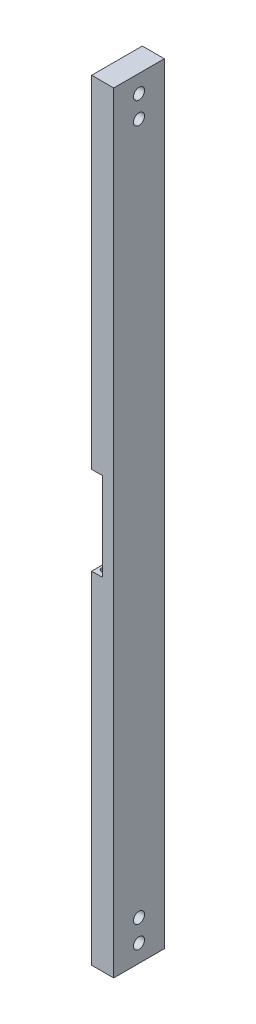
ISO-10303-21;
HEADER;
FILE_DESCRIPTION(('STEP AP214'),'2;1');
FILE_NAME('part.step','',(''),(''),'','','');
FILE_SCHEMA(('AUTOMOTIVE_DESIGN { 1 0 10303 214 1 1 1 1 }'));
ENDSEC;
DATA;
#1=APPLICATION_CONTEXT('core data for automotive mechanical design processes');
#2=APPLICATION_PROTOCOL_DEFINITION('international standard','automotive_design',2000,#1);
#3=PRODUCT_CONTEXT('',#1,'mechanical');
#4=PRODUCT('Part','Part','',(#3));
#5=PRODUCT_RELATED_PRODUCT_CATEGORY('part','',(#4));
#6=PRODUCT_DEFINITION_FORMATION('','',#4);
#7=PRODUCT_DEFINITION_CONTEXT('part definition',#1,'design');
#8=PRODUCT_DEFINITION('design','',#6,#7);
#9=PRODUCT_DEFINITION_SHAPE('','',#8);
#10=(LENGTH_UNIT() NAMED_UNIT(*) SI_UNIT(.MILLI.,.METRE.));
#11=(NAMED_UNIT(*) PLANE_ANGLE_UNIT() SI_UNIT($,.RADIAN.));
#12=(NAMED_UNIT(*) SI_UNIT($,.STERADIAN.) SOLID_ANGLE_UNIT());
#13=UNCERTAINTY_MEASURE_WITH_UNIT(LENGTH_MEASURE(1.E-05),#10,'distance_accuracy_value','');
#14=(GEOMETRIC_REPRESENTATION_CONTEXT(3) GLOBAL_UNCERTAINTY_ASSIGNED_CONTEXT((#13)) GLOBAL_UNIT_ASSIGNED_CONTEXT((#10,
#11,#12)) REPRESENTATION_CONTEXT('',''));
#15=CARTESIAN_POINT('',(0.,0.,0.));
#16=DIRECTION('',(0.,0.,1.));
#17=DIRECTION('',(1.,0.,0.));
#18=AXIS2_PLACEMENT_3D('',#15,#16,#17);
#19=CARTESIAN_POINT('',(-5.,175.,-11.5));
#20=DIRECTION('',(0.,0.,1.));
#21=DIRECTION('',(1.,0.,0.));
#22=AXIS2_PLACEMENT_3D('',#19,#20,#21);
#23=PLANE('',#22);
#24=DIRECTION('',(-1.,0.,0.));
#25=VECTOR('',#24,1.);
#26=CARTESIAN_POINT('',(-4.99999999999939,20.,-11.5));
#27=LINE('',#26,#25);
#28=CARTESIAN_POINT('',(6.12972113628442E-13,20.,-11.5));
#29=VERTEX_POINT('',#28);
#30=CARTESIAN_POINT('',(-4.99999999999939,20.,-11.5));
#31=VERTEX_POINT('',#30);
#32=EDGE_CURVE('E143',#29,#31,#27,.T.);
#33=ORIENTED_EDGE('',*,*,#32,.T.);
#34=DIRECTION('',(0.,-1.,0.));
#35=VECTOR('',#34,1.);
#36=CARTESIAN_POINT('',(-5.,175.,-11.5));
#37=LINE('',#36,#35);
#38=CARTESIAN_POINT('',(-5.,175.,-11.5));
#39=VERTEX_POINT('',#38);
#40=EDGE_CURVE('E42',#39,#31,#37,.T.);
#41=ORIENTED_EDGE('',*,*,#40,.F.);
#42=DIRECTION('',(-1.,0.,0.));
#43=VECTOR('',#42,1.);
#44=CARTESIAN_POINT('',(-5.,175.,-11.5));
#45=LINE('',#44,#43);
#46=CARTESIAN_POINT('',(5.,175.,-11.5));
#47=VERTEX_POINT('',#46);
#48=EDGE_CURVE('E228',#47,#39,#45,.T.);
#49=ORIENTED_EDGE('',*,*,#48,.F.);
#50=DIRECTION('',(0.,-1.,0.));
#51=VECTOR('',#50,1.);
#52=CARTESIAN_POINT('',(5.,175.,-11.5));
#53=LINE('',#52,#51);
#54=CARTESIAN_POINT('',(5.,-175.,-11.5));
#55=VERTEX_POINT('',#54);
#56=EDGE_CURVE('E11',#47,#55,#53,.T.);
#57=ORIENTED_EDGE('',*,*,#56,.T.);
#58=DIRECTION('',(-1.,0.,0.));
#59=VECTOR('',#58,1.);
#60=CARTESIAN_POINT('',(-5.,-175.,-11.5));
#61=LINE('',#60,#59);
#62=CARTESIAN_POINT('',(-5.,-175.,-11.5));
#63=VERTEX_POINT('',#62);
#64=EDGE_CURVE('E238',#55,#63,#61,.T.);
#65=ORIENTED_EDGE('',*,*,#64,.T.);
#66=CARTESIAN_POINT('',(-4.99999999999938,-20.,-11.5));
#67=VERTEX_POINT('',#66);
#68=EDGE_CURVE('E250',#67,#63,#37,.T.);
#69=ORIENTED_EDGE('',*,*,#68,.F.);
#70=DIRECTION('',(1.,0.,0.));
#71=VECTOR('',#70,1.);
#72=CARTESIAN_POINT('',(-4.99999999999938,-20.,-11.5));
#73=LINE('',#72,#71);
#74=CARTESIAN_POINT('',(6.17870700825031E-13,-20.,-11.5));
#75=VERTEX_POINT('',#74);
#76=EDGE_CURVE('E146',#67,#75,#73,.T.);
#77=ORIENTED_EDGE('',*,*,#76,.T.);
#78=DIRECTION('',(0.,1.,0.));
#79=VECTOR('',#78,1.);
#80=CARTESIAN_POINT('',(6.12972113628442E-13,20.,-11.5));
#81=LINE('',#80,#79);
#82=EDGE_CURVE('E138',#75,#29,#81,.T.);
#83=ORIENTED_EDGE('',*,*,#82,.T.);
#84=EDGE_LOOP('',(#33,#41,#49,#57,#65,#69,#77,#83));
#85=FACE_BOUND('',#84,.T.);
#86=ADVANCED_FACE('F34',(#85),#23,.F.);
#87=CARTESIAN_POINT('',(-5.,175.,-11.5));
#88=DIRECTION('',(1.,0.,0.));
#89=DIRECTION('',(0.,0.,-1.));
#90=AXIS2_PLACEMENT_3D('',#87,#88,#89);
#91=PLANE('',#90);
#92=CARTESIAN_POINT('',(-5.,157.,0.));
#93=DIRECTION('',(1.,0.,0.));
#94=DIRECTION('',(0.,0.,-1.));
#95=AXIS2_PLACEMENT_3D('',#92,#93,#94);
#96=CIRCLE('',#95,2.5);
#97=CARTESIAN_POINT('',(-5.,157.,-2.5));
#98=VERTEX_POINT('',#97);
#99=EDGE_CURVE('E220',#98,#98,#96,.T.);
#100=ORIENTED_EDGE('',*,*,#99,.T.);
#101=EDGE_LOOP('',(#100));
#102=FACE_BOUND('',#101,.T.);
#103=CARTESIAN_POINT('',(-5.,167.,0.));
#104=DIRECTION('',(1.,0.,0.));
#105=DIRECTION('',(0.,0.,-1.));
#106=AXIS2_PLACEMENT_3D('',#103,#104,#105);
#107=CIRCLE('',#106,2.5);
#108=CARTESIAN_POINT('',(-5.,167.,-2.5));
#109=VERTEX_POINT('',#108);
#110=EDGE_CURVE('E213',#109,#109,#107,.T.);
#111=ORIENTED_EDGE('',*,*,#110,.T.);
#112=EDGE_LOOP('',(#111));
#113=FACE_BOUND('',#112,.T.);
#114=CARTESIAN_POINT('',(-5.00000000000001,-157.,0.));
#115=DIRECTION('',(1.,0.,0.));
#116=DIRECTION('',(0.,0.,-1.));
#117=AXIS2_PLACEMENT_3D('',#114,#115,#116);
#118=CIRCLE('',#117,2.5);
#119=CARTESIAN_POINT('',(-5.00000000000001,-157.,-2.5));
#120=VERTEX_POINT('',#119);
#121=EDGE_CURVE('E208',#120,#120,#118,.T.);
#122=ORIENTED_EDGE('',*,*,#121,.T.);
#123=EDGE_LOOP('',(#122));
#124=FACE_BOUND('',#123,.T.);
#125=CARTESIAN_POINT('',(-5.00000000000001,-167.,0.));
#126=DIRECTION('',(1.,0.,0.));
#127=DIRECTION('',(0.,0.,-1.));
#128=AXIS2_PLACEMENT_3D('',#125,#126,#127);
#129=CIRCLE('',#128,2.5);
#130=CARTESIAN_POINT('',(-5.00000000000001,-167.,-2.5));
#131=VERTEX_POINT('',#130);
#132=EDGE_CURVE('E201',#131,#131,#129,.T.);
#133=ORIENTED_EDGE('',*,*,#132,.T.);
#134=EDGE_LOOP('',(#133));
#135=FACE_BOUND('',#134,.T.);
#136=DIRECTION('',(0.,0.,-1.));
#137=VECTOR('',#136,1.);
#138=CARTESIAN_POINT('',(-4.99999999999939,20.,-4.5));
#139=LINE('',#138,#137);
#140=CARTESIAN_POINT('',(-4.99999999999939,20.,-4.5));
#141=VERTEX_POINT('',#140);
#142=EDGE_CURVE('E160',#141,#31,#139,.T.);
#143=ORIENTED_EDGE('',*,*,#142,.F.);
#144=DIRECTION('',(0.,-1.,0.));
#145=VECTOR('',#144,1.);
#146=CARTESIAN_POINT('',(-4.99999999999939,20.,-4.5));
#147=LINE('',#146,#145);
#148=CARTESIAN_POINT('',(-5.,-20.,-4.5));
#149=VERTEX_POINT('',#148);
#150=EDGE_CURVE('E129',#141,#149,#147,.T.);
#151=ORIENTED_EDGE('',*,*,#150,.T.);
#152=DIRECTION('',(0.,0.,-1.));
#153=VECTOR('',#152,1.);
#154=CARTESIAN_POINT('',(-4.99999999999938,-20.,-4.5));
#155=LINE('',#154,#153);
#156=EDGE_CURVE('E127',#149,#67,#155,.T.);
#157=ORIENTED_EDGE('',*,*,#156,.T.);
#158=ORIENTED_EDGE('',*,*,#68,.T.);
#159=DIRECTION('',(0.,0.,1.));
#160=VECTOR('',#159,1.);
#161=CARTESIAN_POINT('',(-5.,-175.,-11.5));
#162=LINE('',#161,#160);
#163=CARTESIAN_POINT('',(-5.,-175.,11.5));
#164=VERTEX_POINT('',#163);
#165=EDGE_CURVE('E241',#63,#164,#162,.T.);
#166=ORIENTED_EDGE('',*,*,#165,.T.);
#167=DIRECTION('',(0.,-1.,0.));
#168=VECTOR('',#167,1.);
#169=CARTESIAN_POINT('',(-5.,175.,11.5));
#170=LINE('',#169,#168);
#171=CARTESIAN_POINT('',(-4.99999999999938,-20.,11.5));
#172=VERTEX_POINT('',#171);
#173=EDGE_CURVE('E247',#172,#164,#170,.T.);
#174=ORIENTED_EDGE('',*,*,#173,.F.);
#175=DIRECTION('',(0.,0.,1.));
#176=VECTOR('',#175,1.);
#177=CARTESIAN_POINT('',(-4.99999999999938,-20.,4.5));
#178=LINE('',#177,#176);
#179=CARTESIAN_POINT('',(-4.99999999999938,-20.,4.5));
#180=VERTEX_POINT('',#179);
#181=EDGE_CURVE('E195',#180,#172,#178,.T.);
#182=ORIENTED_EDGE('',*,*,#181,.F.);
#183=DIRECTION('',(0.,-1.,0.));
#184=VECTOR('',#183,1.);
#185=CARTESIAN_POINT('',(-4.99999999999939,20.,4.5));
#186=LINE('',#185,#184);
#187=CARTESIAN_POINT('',(-4.99999999999939,20.,4.5));
#188=VERTEX_POINT('',#187);
#189=EDGE_CURVE('E181',#188,#180,#186,.T.);
#190=ORIENTED_EDGE('',*,*,#189,.F.);
#191=DIRECTION('',(0.,0.,1.));
#192=VECTOR('',#191,1.);
#193=CARTESIAN_POINT('',(-4.99999999999939,20.,4.5));
#194=LINE('',#193,#192);
#195=CARTESIAN_POINT('',(-4.99999999999939,20.,11.5));
#196=VERTEX_POINT('',#195);
#197=EDGE_CURVE('E197',#188,#196,#194,.T.);
#198=ORIENTED_EDGE('',*,*,#197,.T.);
#199=CARTESIAN_POINT('',(-5.,175.,11.5));
#200=VERTEX_POINT('',#199);
#201=EDGE_CURVE('E248',#200,#196,#170,.T.);
#202=ORIENTED_EDGE('',*,*,#201,.F.);
#203=DIRECTION('',(0.,0.,1.));
#204=VECTOR('',#203,1.);
#205=CARTESIAN_POINT('',(-5.,175.,-11.5));
#206=LINE('',#205,#204);
#207=EDGE_CURVE('E231',#39,#200,#206,.T.);
#208=ORIENTED_EDGE('',*,*,#207,.F.);
#209=ORIENTED_EDGE('',*,*,#40,.T.);
#210=EDGE_LOOP('',(#143,#151,#157,#158,#166,#174,#182,#190,#198,#202,#208,#209));
#211=FACE_BOUND('',#210,.T.);
#212=ADVANCED_FACE('F257',(#102,#113,#124,#135,#211),#91,.F.);
#213=CARTESIAN_POINT('',(5.,175.,-11.5));
#214=DIRECTION('',(-1.,0.,0.));
#215=DIRECTION('',(0.,0.,1.));
#216=AXIS2_PLACEMENT_3D('',#213,#214,#215);
#217=PLANE('',#216);
#218=CARTESIAN_POINT('',(5.,-167.,0.));
#219=DIRECTION('',(1.,0.,0.));
#220=DIRECTION('',(0.,0.,-1.));
#221=AXIS2_PLACEMENT_3D('',#218,#219,#220);
#222=CIRCLE('',#221,2.5);
#223=CARTESIAN_POINT('',(5.,-167.,-2.5));
#224=VERTEX_POINT('',#223);
#225=EDGE_CURVE('E205',#224,#224,#222,.T.);
#226=ORIENTED_EDGE('',*,*,#225,.F.);
#227=EDGE_LOOP('',(#226));
#228=FACE_BOUND('',#227,.T.);
#229=CARTESIAN_POINT('',(5.,-157.,0.));
#230=DIRECTION('',(1.,0.,0.));
#231=DIRECTION('',(0.,0.,-1.));
#232=AXIS2_PLACEMENT_3D('',#229,#230,#231);
#233=CIRCLE('',#232,2.5);
#234=CARTESIAN_POINT('',(5.,-157.,-2.5));
#235=VERTEX_POINT('',#234);
#236=EDGE_CURVE('E194',#235,#235,#233,.T.);
#237=ORIENTED_EDGE('',*,*,#236,.F.);
#238=EDGE_LOOP('',(#237));
#239=FACE_BOUND('',#238,.T.);
#240=CARTESIAN_POINT('',(5.,167.,0.));
#241=DIRECTION('',(1.,0.,0.));
#242=DIRECTION('',(0.,0.,-1.));
#243=AXIS2_PLACEMENT_3D('',#240,#241,#242);
#244=CIRCLE('',#243,2.5);
#245=CARTESIAN_POINT('',(5.,167.,-2.5));
#246=VERTEX_POINT('',#245);
#247=EDGE_CURVE('E217',#246,#246,#244,.T.);
#248=ORIENTED_EDGE('',*,*,#247,.F.);
#249=EDGE_LOOP('',(#248));
#250=FACE_BOUND('',#249,.T.);
#251=CARTESIAN_POINT('',(5.,157.,0.));
#252=DIRECTION('',(1.,0.,0.));
#253=DIRECTION('',(0.,0.,-1.));
#254=AXIS2_PLACEMENT_3D('',#251,#252,#253);
#255=CIRCLE('',#254,2.5);
#256=CARTESIAN_POINT('',(5.,157.,-2.5));
#257=VERTEX_POINT('',#256);
#258=EDGE_CURVE('E204',#257,#257,#255,.T.);
#259=ORIENTED_EDGE('',*,*,#258,.F.);
#260=EDGE_LOOP('',(#259));
#261=FACE_BOUND('',#260,.T.);
#262=DIRECTION('',(0.,0.,-1.));
#263=VECTOR('',#262,1.);
#264=CARTESIAN_POINT('',(5.,-175.,-11.5));
#265=LINE('',#264,#263);
#266=CARTESIAN_POINT('',(5.,-175.,11.5));
#267=VERTEX_POINT('',#266);
#268=EDGE_CURVE('E216',#267,#55,#265,.T.);
#269=ORIENTED_EDGE('',*,*,#268,.T.);
#270=ORIENTED_EDGE('',*,*,#56,.F.);
#271=DIRECTION('',(0.,0.,-1.));
#272=VECTOR('',#271,1.);
#273=CARTESIAN_POINT('',(5.,175.,-11.5));
#274=LINE('',#273,#272);
#275=CARTESIAN_POINT('',(5.,175.,11.5));
#276=VERTEX_POINT('',#275);
#277=EDGE_CURVE('E225',#276,#47,#274,.T.);
#278=ORIENTED_EDGE('',*,*,#277,.F.);
#279=DIRECTION('',(0.,-1.,0.));
#280=VECTOR('',#279,1.);
#281=CARTESIAN_POINT('',(5.,175.,11.5));
#282=LINE('',#281,#280);
#283=EDGE_CURVE('E235',#276,#267,#282,.T.);
#284=ORIENTED_EDGE('',*,*,#283,.T.);
#285=EDGE_LOOP('',(#269,#270,#278,#284));
#286=FACE_BOUND('',#285,.T.);
#287=ADVANCED_FACE('F36',(#228,#239,#250,#261,#286),#217,.F.);
#288=CARTESIAN_POINT('',(-5.,175.,11.5));
#289=DIRECTION('',(0.,0.,-1.));
#290=DIRECTION('',(-1.,0.,0.));
#291=AXIS2_PLACEMENT_3D('',#288,#289,#290);
#292=PLANE('',#291);
#293=DIRECTION('',(0.,1.,0.));
#294=VECTOR('',#293,1.);
#295=CARTESIAN_POINT('',(6.12972113628442E-13,20.,11.5));
#296=LINE('',#295,#294);
#297=CARTESIAN_POINT('',(6.17870700825031E-13,-20.,11.5));
#298=VERTEX_POINT('',#297);
#299=CARTESIAN_POINT('',(6.13224748757801E-13,20.,11.5));
#300=VERTEX_POINT('',#299);
#301=EDGE_CURVE('E57',#298,#300,#296,.T.);
#302=ORIENTED_EDGE('',*,*,#301,.F.);
#303=DIRECTION('',(1.,0.,0.));
#304=VECTOR('',#303,1.);
#305=CARTESIAN_POINT('',(-4.99999999999938,-20.,11.5));
#306=LINE('',#305,#304);
#307=EDGE_CURVE('E178',#172,#298,#306,.T.);
#308=ORIENTED_EDGE('',*,*,#307,.F.);
#309=ORIENTED_EDGE('',*,*,#173,.T.);
#310=DIRECTION('',(1.,0.,0.));
#311=VECTOR('',#310,1.);
#312=CARTESIAN_POINT('',(-5.,-175.,11.5));
#313=LINE('',#312,#311);
#314=EDGE_CURVE('E229',#164,#267,#313,.T.);
#315=ORIENTED_EDGE('',*,*,#314,.T.);
#316=ORIENTED_EDGE('',*,*,#283,.F.);
#317=DIRECTION('',(1.,0.,0.));
#318=VECTOR('',#317,1.);
#319=CARTESIAN_POINT('',(-5.,175.,11.5));
#320=LINE('',#319,#318);
#321=EDGE_CURVE('E233',#200,#276,#320,.T.);
#322=ORIENTED_EDGE('',*,*,#321,.F.);
#323=ORIENTED_EDGE('',*,*,#201,.T.);
#324=DIRECTION('',(-1.,0.,0.));
#325=VECTOR('',#324,1.);
#326=CARTESIAN_POINT('',(-4.99999999999939,20.,11.5));
#327=LINE('',#326,#325);
#328=EDGE_CURVE('E188',#300,#196,#327,.T.);
#329=ORIENTED_EDGE('',*,*,#328,.F.);
#330=EDGE_LOOP('',(#302,#308,#309,#315,#316,#322,#323,#329));
#331=FACE_BOUND('',#330,.T.);
#332=ADVANCED_FACE('F268',(#331),#292,.F.);
#333=CARTESIAN_POINT('',(0.,175.,0.));
#334=DIRECTION('',(0.,1.,0.));
#335=DIRECTION('',(0.,0.,1.));
#336=AXIS2_PLACEMENT_3D('',#333,#334,#335);
#337=PLANE('',#336);
#338=ORIENTED_EDGE('',*,*,#277,.T.);
#339=ORIENTED_EDGE('',*,*,#48,.T.);
#340=ORIENTED_EDGE('',*,*,#207,.T.);
#341=ORIENTED_EDGE('',*,*,#321,.T.);
#342=EDGE_LOOP('',(#338,#339,#340,#341));
#343=FACE_BOUND('',#342,.T.);
#344=ADVANCED_FACE('F274',(#343),#337,.T.);
#345=CARTESIAN_POINT('',(0.,-175.,0.));
#346=DIRECTION('',(0.,1.,0.));
#347=DIRECTION('',(0.,0.,1.));
#348=AXIS2_PLACEMENT_3D('',#345,#346,#347);
#349=PLANE('',#348);
#350=ORIENTED_EDGE('',*,*,#268,.F.);
#351=ORIENTED_EDGE('',*,*,#314,.F.);
#352=ORIENTED_EDGE('',*,*,#165,.F.);
#353=ORIENTED_EDGE('',*,*,#64,.F.);
#354=EDGE_LOOP('',(#350,#351,#352,#353));
#355=FACE_BOUND('',#354,.T.);
#356=ADVANCED_FACE('F265',(#355),#349,.F.);
#357=CARTESIAN_POINT('',(-5.,157.,0.));
#358=DIRECTION('',(1.,0.,0.));
#359=DIRECTION('',(0.,0.,-1.));
#360=AXIS2_PLACEMENT_3D('',#357,#358,#359);
#361=CYLINDRICAL_SURFACE('',#360,2.5);
#362=CARTESIAN_POINT('',(-5.,157.,-2.5));
#363=CARTESIAN_POINT('',(-4.89583333333334,157.,-2.5));
#364=CARTESIAN_POINT('',(-4.79166666666667,157.,-2.5));
#365=CARTESIAN_POINT('',(-4.58333333333334,157.,-2.5));
#366=CARTESIAN_POINT('',(-4.47916666666667,157.,-2.5));
#367=CARTESIAN_POINT('',(-4.27083333333334,157.,-2.5));
#368=CARTESIAN_POINT('',(-4.16666666666667,157.,-2.5));
#369=CARTESIAN_POINT('',(-3.95833333333334,157.,-2.5));
#370=CARTESIAN_POINT('',(-3.85416666666667,157.,-2.5));
#371=CARTESIAN_POINT('',(-3.64583333333334,157.,-2.5));
#372=CARTESIAN_POINT('',(-3.54166666666667,157.,-2.5));
#373=CARTESIAN_POINT('',(-3.33333333333334,157.,-2.5));
#374=CARTESIAN_POINT('',(-3.22916666666667,157.,-2.5));
#375=CARTESIAN_POINT('',(-3.02083333333334,157.,-2.5));
#376=CARTESIAN_POINT('',(-2.91666666666667,157.,-2.5));
#377=CARTESIAN_POINT('',(-2.70833333333334,157.,-2.5));
#378=CARTESIAN_POINT('',(-2.60416666666667,157.,-2.5));
#379=CARTESIAN_POINT('',(-2.39583333333334,157.,-2.5));
#380=CARTESIAN_POINT('',(-2.29166666666667,157.,-2.5));
#381=CARTESIAN_POINT('',(-2.08333333333334,157.,-2.5));
#382=CARTESIAN_POINT('',(-1.97916666666667,157.,-2.5));
#383=CARTESIAN_POINT('',(-1.77083333333334,157.,-2.5));
#384=CARTESIAN_POINT('',(-1.66666666666667,157.,-2.5));
#385=CARTESIAN_POINT('',(-1.45833333333334,157.,-2.5));
#386=CARTESIAN_POINT('',(-1.35416666666667,157.,-2.5));
#387=CARTESIAN_POINT('',(-1.14583333333334,157.,-2.5));
#388=CARTESIAN_POINT('',(-1.04166666666667,157.,-2.5));
#389=CARTESIAN_POINT('',(-0.833333333333336,157.,-2.5));
#390=CARTESIAN_POINT('',(-0.729166666666669,157.,-2.5));
#391=CARTESIAN_POINT('',(-0.520833333333335,157.,-2.5));
#392=CARTESIAN_POINT('',(-0.416666666666669,157.,-2.5));
#393=CARTESIAN_POINT('',(-0.208333333333335,157.,-2.5));
#394=CARTESIAN_POINT('',(-0.104166666666668,157.,-2.5));
#395=CARTESIAN_POINT('',(0.104166666666665,157.,-2.5));
#396=CARTESIAN_POINT('',(0.208333333333332,157.,-2.5));
#397=CARTESIAN_POINT('',(0.416666666666665,157.,-2.5));
#398=CARTESIAN_POINT('',(0.520833333333332,157.,-2.5));
#399=CARTESIAN_POINT('',(0.729166666666666,157.,-2.5));
#400=CARTESIAN_POINT('',(0.833333333333332,157.,-2.5));
#401=CARTESIAN_POINT('',(1.04166666666667,157.,-2.5));
#402=CARTESIAN_POINT('',(1.14583333333333,157.,-2.5));
#403=CARTESIAN_POINT('',(1.35416666666667,157.,-2.5));
#404=CARTESIAN_POINT('',(1.45833333333333,157.,-2.5));
#405=CARTESIAN_POINT('',(1.66666666666667,157.,-2.5));
#406=CARTESIAN_POINT('',(1.77083333333333,157.,-2.5));
#407=CARTESIAN_POINT('',(1.97916666666667,157.,-2.5));
#408=CARTESIAN_POINT('',(2.08333333333333,157.,-2.5));
#409=CARTESIAN_POINT('',(2.29166666666667,157.,-2.5));
#410=CARTESIAN_POINT('',(2.39583333333333,157.,-2.5));
#411=CARTESIAN_POINT('',(2.60416666666667,157.,-2.5));
#412=CARTESIAN_POINT('',(2.70833333333333,157.,-2.5));
#413=CARTESIAN_POINT('',(2.91666666666667,157.,-2.5));
#414=CARTESIAN_POINT('',(3.02083333333333,157.,-2.5));
#415=CARTESIAN_POINT('',(3.22916666666667,157.,-2.5));
#416=CARTESIAN_POINT('',(3.33333333333333,157.,-2.5));
#417=CARTESIAN_POINT('',(3.54166666666667,157.,-2.5));
#418=CARTESIAN_POINT('',(3.64583333333333,157.,-2.5));
#419=CARTESIAN_POINT('',(3.85416666666667,157.,-2.5));
#420=CARTESIAN_POINT('',(3.95833333333333,157.,-2.5));
#421=CARTESIAN_POINT('',(4.16666666666667,157.,-2.5));
#422=CARTESIAN_POINT('',(4.27083333333333,157.,-2.5));
#423=CARTESIAN_POINT('',(4.47916666666667,157.,-2.5));
#424=CARTESIAN_POINT('',(4.58333333333333,157.,-2.5));
#425=CARTESIAN_POINT('',(4.79166666666667,157.,-2.5));
#426=CARTESIAN_POINT('',(4.89583333333333,157.,-2.5));
#427=CARTESIAN_POINT('',(5.,157.,-2.5));
#428=B_SPLINE_CURVE_WITH_KNOTS('',3,(#362,#363,#364,#365,#366,#367,#368,#369,#370,#371,#372,
#373,#374,#375,#376,#377,#378,#379,#380,#381,#382,#383,#384,#385,#386,#387,#388,#389,#390,#391,
#392,#393,#394,#395,#396,#397,#398,#399,#400,#401,#402,#403,#404,#405,#406,#407,#408,#409,#410,
#411,#412,#413,#414,#415,#416,#417,#418,#419,#420,#421,#422,#423,#424,#425,#426,#427),
.UNSPECIFIED.,.F.,.F.,(4,2,2,2,2,2,2,2,2,2,2,2,2,2,2,2,2,2,2,2,2,2,2,2,2,2,2,2,2,2,2,2,4),(0.,
0.312499999999999,0.625,0.9375,1.25,1.5625,1.875,2.1875,2.5,2.8125,3.125,3.4375,3.75,4.0625,
4.375,4.6875,5.,5.3125,5.625,5.9375,6.25,6.5625,6.875,7.1875,7.5,7.8125,8.125,8.4375,8.75,
9.0625,9.375,9.6875,10.),.UNSPECIFIED.);
#429=EDGE_CURVE('BSEAM312',#98,#257,#428,.T.);
#430=ORIENTED_EDGE('',*,*,#99,.F.);
#431=ORIENTED_EDGE('',*,*,#258,.T.);
#432=ORIENTED_EDGE('',*,*,#429,.T.);
#433=ORIENTED_EDGE('',*,*,#429,.F.);
#434=EDGE_LOOP('',(#430,#432,#431,#433));
#435=FACE_BOUND('',#434,.T.);
#436=ADVANCED_FACE('F312',(#435),#361,.F.);
#437=CARTESIAN_POINT('',(-5.,167.,0.));
#438=DIRECTION('',(1.,0.,0.));
#439=DIRECTION('',(0.,0.,-1.));
#440=AXIS2_PLACEMENT_3D('',#437,#438,#439);
#441=CYLINDRICAL_SURFACE('',#440,2.5);
#442=CARTESIAN_POINT('',(-5.,167.,-2.5));
#443=CARTESIAN_POINT('',(-4.89583333333334,167.,-2.5));
#444=CARTESIAN_POINT('',(-4.79166666666667,167.,-2.5));
#445=CARTESIAN_POINT('',(-4.58333333333334,167.,-2.5));
#446=CARTESIAN_POINT('',(-4.47916666666667,167.,-2.5));
#447=CARTESIAN_POINT('',(-4.27083333333334,167.,-2.5));
#448=CARTESIAN_POINT('',(-4.16666666666667,167.,-2.5));
#449=CARTESIAN_POINT('',(-3.95833333333334,167.,-2.5));
#450=CARTESIAN_POINT('',(-3.85416666666667,167.,-2.5));
#451=CARTESIAN_POINT('',(-3.64583333333334,167.,-2.5));
#452=CARTESIAN_POINT('',(-3.54166666666667,167.,-2.5));
#453=CARTESIAN_POINT('',(-3.33333333333334,167.,-2.5));
#454=CARTESIAN_POINT('',(-3.22916666666667,167.,-2.5));
#455=CARTESIAN_POINT('',(-3.02083333333334,167.,-2.5));
#456=CARTESIAN_POINT('',(-2.91666666666667,167.,-2.5));
#457=CARTESIAN_POINT('',(-2.70833333333334,167.,-2.5));
#458=CARTESIAN_POINT('',(-2.60416666666667,167.,-2.5));
#459=CARTESIAN_POINT('',(-2.39583333333334,167.,-2.5));
#460=CARTESIAN_POINT('',(-2.29166666666667,167.,-2.5));
#461=CARTESIAN_POINT('',(-2.08333333333334,167.,-2.5));
#462=CARTESIAN_POINT('',(-1.97916666666667,167.,-2.5));
#463=CARTESIAN_POINT('',(-1.77083333333334,167.,-2.5));
#464=CARTESIAN_POINT('',(-1.66666666666667,167.,-2.5));
#465=CARTESIAN_POINT('',(-1.45833333333334,167.,-2.5));
#466=CARTESIAN_POINT('',(-1.35416666666667,167.,-2.5));
#467=CARTESIAN_POINT('',(-1.14583333333334,167.,-2.5));
#468=CARTESIAN_POINT('',(-1.04166666666667,167.,-2.5));
#469=CARTESIAN_POINT('',(-0.833333333333336,167.,-2.5));
#470=CARTESIAN_POINT('',(-0.729166666666669,167.,-2.5));
#471=CARTESIAN_POINT('',(-0.520833333333335,167.,-2.5));
#472=CARTESIAN_POINT('',(-0.416666666666669,167.,-2.5));
#473=CARTESIAN_POINT('',(-0.208333333333335,167.,-2.5));
#474=CARTESIAN_POINT('',(-0.104166666666668,167.,-2.5));
#475=CARTESIAN_POINT('',(0.104166666666665,167.,-2.5));
#476=CARTESIAN_POINT('',(0.208333333333332,167.,-2.5));
#477=CARTESIAN_POINT('',(0.416666666666665,167.,-2.5));
#478=CARTESIAN_POINT('',(0.520833333333332,167.,-2.5));
#479=CARTESIAN_POINT('',(0.729166666666666,167.,-2.5));
#480=CARTESIAN_POINT('',(0.833333333333332,167.,-2.5));
#481=CARTESIAN_POINT('',(1.04166666666667,167.,-2.5));
#482=CARTESIAN_POINT('',(1.14583333333333,167.,-2.5));
#483=CARTESIAN_POINT('',(1.35416666666667,167.,-2.5));
#484=CARTESIAN_POINT('',(1.45833333333333,167.,-2.5));
#485=CARTESIAN_POINT('',(1.66666666666667,167.,-2.5));
#486=CARTESIAN_POINT('',(1.77083333333333,167.,-2.5));
#487=CARTESIAN_POINT('',(1.97916666666667,167.,-2.5));
#488=CARTESIAN_POINT('',(2.08333333333333,167.,-2.5));
#489=CARTESIAN_POINT('',(2.29166666666667,167.,-2.5));
#490=CARTESIAN_POINT('',(2.39583333333333,167.,-2.5));
#491=CARTESIAN_POINT('',(2.60416666666667,167.,-2.5));
#492=CARTESIAN_POINT('',(2.70833333333333,167.,-2.5));
#493=CARTESIAN_POINT('',(2.91666666666667,167.,-2.5));
#494=CARTESIAN_POINT('',(3.02083333333333,167.,-2.5));
#495=CARTESIAN_POINT('',(3.22916666666667,167.,-2.5));
#496=CARTESIAN_POINT('',(3.33333333333333,167.,-2.5));
#497=CARTESIAN_POINT('',(3.54166666666667,167.,-2.5));
#498=CARTESIAN_POINT('',(3.64583333333333,167.,-2.5));
#499=CARTESIAN_POINT('',(3.85416666666667,167.,-2.5));
#500=CARTESIAN_POINT('',(3.95833333333333,167.,-2.5));
#501=CARTESIAN_POINT('',(4.16666666666667,167.,-2.5));
#502=CARTESIAN_POINT('',(4.27083333333333,167.,-2.5));
#503=CARTESIAN_POINT('',(4.47916666666667,167.,-2.5));
#504=CARTESIAN_POINT('',(4.58333333333333,167.,-2.5));
#505=CARTESIAN_POINT('',(4.79166666666667,167.,-2.5));
#506=CARTESIAN_POINT('',(4.89583333333333,167.,-2.5));
#507=CARTESIAN_POINT('',(5.,167.,-2.5));
#508=B_SPLINE_CURVE_WITH_KNOTS('',3,(#442,#443,#444,#445,#446,#447,#448,#449,#450,#451,#452,
#453,#454,#455,#456,#457,#458,#459,#460,#461,#462,#463,#464,#465,#466,#467,#468,#469,#470,#471,
#472,#473,#474,#475,#476,#477,#478,#479,#480,#481,#482,#483,#484,#485,#486,#487,#488,#489,#490,
#491,#492,#493,#494,#495,#496,#497,#498,#499,#500,#501,#502,#503,#504,#505,#506,#507),
.UNSPECIFIED.,.F.,.F.,(4,2,2,2,2,2,2,2,2,2,2,2,2,2,2,2,2,2,2,2,2,2,2,2,2,2,2,2,2,2,2,2,4),(0.,
0.312499999999999,0.625,0.9375,1.25,1.5625,1.875,2.1875,2.5,2.8125,3.125,3.4375,3.75,4.0625,
4.375,4.6875,5.,5.3125,5.625,5.9375,6.25,6.5625,6.875,7.1875,7.5,7.8125,8.125,8.4375,8.75,
9.0625,9.375,9.6875,10.),.UNSPECIFIED.);
#509=EDGE_CURVE('BSEAM317',#109,#246,#508,.T.);
#510=ORIENTED_EDGE('',*,*,#110,.F.);
#511=ORIENTED_EDGE('',*,*,#247,.T.);
#512=ORIENTED_EDGE('',*,*,#509,.T.);
#513=ORIENTED_EDGE('',*,*,#509,.F.);
#514=EDGE_LOOP('',(#510,#512,#511,#513));
#515=FACE_BOUND('',#514,.T.);
#516=ADVANCED_FACE('F317',(#515),#441,.F.);
#517=CARTESIAN_POINT('',(-5.00000000000001,-157.,0.));
#518=DIRECTION('',(1.,0.,0.));
#519=DIRECTION('',(0.,0.,-1.));
#520=AXIS2_PLACEMENT_3D('',#517,#518,#519);
#521=CYLINDRICAL_SURFACE('',#520,2.5);
#522=ORIENTED_EDGE('',*,*,#121,.F.);
#523=EDGE_LOOP('',(#522));
#524=FACE_BOUND('',#523,.T.);
#525=ORIENTED_EDGE('',*,*,#236,.T.);
#526=EDGE_LOOP('',(#525));
#527=FACE_BOUND('',#526,.T.);
#528=ADVANCED_FACE('F321',(#524,#527),#521,.F.);
#529=CARTESIAN_POINT('',(-5.00000000000001,-167.,0.));
#530=DIRECTION('',(1.,0.,0.));
#531=DIRECTION('',(0.,0.,-1.));
#532=AXIS2_PLACEMENT_3D('',#529,#530,#531);
#533=CYLINDRICAL_SURFACE('',#532,2.5);
#534=ORIENTED_EDGE('',*,*,#132,.F.);
#535=EDGE_LOOP('',(#534));
#536=FACE_BOUND('',#535,.T.);
#537=ORIENTED_EDGE('',*,*,#225,.T.);
#538=EDGE_LOOP('',(#537));
#539=FACE_BOUND('',#538,.T.);
#540=ADVANCED_FACE('F298',(#536,#539),#533,.F.);
#541=CARTESIAN_POINT('',(6.12972113628442E-13,20.,4.5));
#542=DIRECTION('',(1.,0.,0.));
#543=DIRECTION('',(0.,1.,0.));
#544=AXIS2_PLACEMENT_3D('',#541,#542,#543);
#545=PLANE('',#544);
#546=ORIENTED_EDGE('',*,*,#301,.T.);
#547=DIRECTION('',(0.,0.,1.));
#548=VECTOR('',#547,1.);
#549=CARTESIAN_POINT('',(6.12972113628442E-13,20.,4.5));
#550=LINE('',#549,#548);
#551=CARTESIAN_POINT('',(6.12972113628442E-13,20.,4.5));
#552=VERTEX_POINT('',#551);
#553=EDGE_CURVE('E186',#552,#300,#550,.T.);
#554=ORIENTED_EDGE('',*,*,#553,.F.);
#555=DIRECTION('',(0.,1.,0.));
#556=VECTOR('',#555,1.);
#557=CARTESIAN_POINT('',(6.12972113628442E-13,20.,4.5));
#558=LINE('',#557,#556);
#559=CARTESIAN_POINT('',(6.17870700825031E-13,-20.,4.5));
#560=VERTEX_POINT('',#559);
#561=EDGE_CURVE('E174',#560,#552,#558,.T.);
#562=ORIENTED_EDGE('',*,*,#561,.F.);
#563=DIRECTION('',(0.,0.,1.));
#564=VECTOR('',#563,1.);
#565=CARTESIAN_POINT('',(6.17870700825031E-13,-20.,4.5));
#566=LINE('',#565,#564);
#567=EDGE_CURVE('E192',#560,#298,#566,.T.);
#568=ORIENTED_EDGE('',*,*,#567,.T.);
#569=EDGE_LOOP('',(#546,#554,#562,#568));
#570=FACE_BOUND('',#569,.T.);
#571=ADVANCED_FACE('F286',(#570),#545,.F.);
#572=CARTESIAN_POINT('',(-4.99999999999938,-20.,4.5));
#573=DIRECTION('',(0.,-1.,0.));
#574=DIRECTION('',(0.,0.,-1.));
#575=AXIS2_PLACEMENT_3D('',#572,#573,#574);
#576=PLANE('',#575);
#577=CARTESIAN_POINT('',(-2.49999999999939,-20.,8.));
#578=DIRECTION('',(0.,-1.,0.));
#579=DIRECTION('',(0.,0.,-1.));
#580=AXIS2_PLACEMENT_3D('',#577,#578,#579);
#581=CIRCLE('',#580,1.5);
#582=CARTESIAN_POINT('',(-2.49999999999939,-20.,6.5));
#583=VERTEX_POINT('',#582);
#584=EDGE_CURVE('E159',#583,#583,#581,.T.);
#585=ORIENTED_EDGE('',*,*,#584,.T.);
#586=EDGE_LOOP('',(#585));
#587=FACE_BOUND('',#586,.T.);
#588=ORIENTED_EDGE('',*,*,#307,.T.);
#589=ORIENTED_EDGE('',*,*,#567,.F.);
#590=DIRECTION('',(1.,0.,0.));
#591=VECTOR('',#590,1.);
#592=CARTESIAN_POINT('',(-4.99999999999938,-20.,4.5));
#593=LINE('',#592,#591);
#594=EDGE_CURVE('E183',#180,#560,#593,.T.);
#595=ORIENTED_EDGE('',*,*,#594,.F.);
#596=ORIENTED_EDGE('',*,*,#181,.T.);
#597=EDGE_LOOP('',(#588,#589,#595,#596));
#598=FACE_BOUND('',#597,.T.);
#599=ADVANCED_FACE('F288',(#587,#598),#576,.F.);
#600=CARTESIAN_POINT('',(-4.99999999999939,20.,4.5));
#601=DIRECTION('',(0.,1.,0.));
#602=DIRECTION('',(0.,0.,1.));
#603=AXIS2_PLACEMENT_3D('',#600,#601,#602);
#604=PLANE('',#603);
#605=CARTESIAN_POINT('',(-2.49999999999939,20.,8.));
#606=DIRECTION('',(0.,-1.,0.));
#607=DIRECTION('',(0.,0.,-1.));
#608=AXIS2_PLACEMENT_3D('',#605,#606,#607);
#609=CIRCLE('',#608,1.5);
#610=CARTESIAN_POINT('',(-2.49999999999939,20.,6.5));
#611=VERTEX_POINT('',#610);
#612=EDGE_CURVE('E166',#611,#611,#609,.T.);
#613=ORIENTED_EDGE('',*,*,#612,.F.);
#614=EDGE_LOOP('',(#613));
#615=FACE_BOUND('',#614,.T.);
#616=ORIENTED_EDGE('',*,*,#328,.T.);
#617=ORIENTED_EDGE('',*,*,#197,.F.);
#618=DIRECTION('',(-1.,0.,0.));
#619=VECTOR('',#618,1.);
#620=CARTESIAN_POINT('',(-4.99999999999939,20.,4.5));
#621=LINE('',#620,#619);
#622=EDGE_CURVE('E177',#552,#188,#621,.T.);
#623=ORIENTED_EDGE('',*,*,#622,.F.);
#624=ORIENTED_EDGE('',*,*,#553,.T.);
#625=EDGE_LOOP('',(#616,#617,#623,#624));
#626=FACE_BOUND('',#625,.T.);
#627=ADVANCED_FACE('F281',(#615,#626),#604,.F.);
#628=CARTESIAN_POINT('',(0.,0.,4.5));
#629=DIRECTION('',(0.,0.,1.));
#630=DIRECTION('',(1.,0.,0.));
#631=AXIS2_PLACEMENT_3D('',#628,#629,#630);
#632=PLANE('',#631);
#633=ORIENTED_EDGE('',*,*,#561,.T.);
#634=ORIENTED_EDGE('',*,*,#622,.T.);
#635=ORIENTED_EDGE('',*,*,#189,.T.);
#636=ORIENTED_EDGE('',*,*,#594,.T.);
#637=EDGE_LOOP('',(#633,#634,#635,#636));
#638=FACE_BOUND('',#637,.T.);
#639=ADVANCED_FACE('F283',(#638),#632,.T.);
#640=CARTESIAN_POINT('',(-2.49999999999939,25.,8.));
#641=DIRECTION('',(0.,-1.,0.));
#642=DIRECTION('',(0.,0.,-1.));
#643=AXIS2_PLACEMENT_3D('',#640,#641,#642);
#644=CYLINDRICAL_SURFACE('',#643,1.5);
#645=CARTESIAN_POINT('',(-2.49999999999939,25.,8.));
#646=DIRECTION('',(0.,-1.,0.));
#647=DIRECTION('',(0.,0.,-1.));
#648=AXIS2_PLACEMENT_3D('',#645,#646,#647);
#649=CIRCLE('',#648,1.5);
#650=CARTESIAN_POINT('',(-2.49999999999939,25.,6.5));
#651=VERTEX_POINT('',#650);
#652=EDGE_CURVE('E169',#651,#651,#649,.T.);
#653=ORIENTED_EDGE('',*,*,#652,.F.);
#654=EDGE_LOOP('',(#653));
#655=FACE_BOUND('',#654,.T.);
#656=ORIENTED_EDGE('',*,*,#612,.T.);
#657=EDGE_LOOP('',(#656));
#658=FACE_BOUND('',#657,.T.);
#659=ADVANCED_FACE('F403',(#655,#658),#644,.F.);
#660=CARTESIAN_POINT('',(0.,25.,0.));
#661=DIRECTION('',(0.,-1.,0.));
#662=DIRECTION('',(0.,0.,-1.));
#663=AXIS2_PLACEMENT_3D('',#660,#661,#662);
#664=PLANE('',#663);
#665=ORIENTED_EDGE('',*,*,#652,.T.);
#666=EDGE_LOOP('',(#665));
#667=FACE_BOUND('',#666,.T.);
#668=ADVANCED_FACE('F409',(#667),#664,.T.);
#669=CARTESIAN_POINT('',(-2.49999999999939,-25.,8.));
#670=DIRECTION('',(0.,1.,0.));
#671=DIRECTION('',(0.,0.,1.));
#672=AXIS2_PLACEMENT_3D('',#669,#670,#671);
#673=CYLINDRICAL_SURFACE('',#672,1.5);
#674=CARTESIAN_POINT('',(-2.49999999999939,-25.,8.));
#675=DIRECTION('',(0.,-1.,0.));
#676=DIRECTION('',(0.,0.,-1.));
#677=AXIS2_PLACEMENT_3D('',#674,#675,#676);
#678=CIRCLE('',#677,1.5);
#679=CARTESIAN_POINT('',(-2.49999999999939,-25.,6.5));
#680=VERTEX_POINT('',#679);
#681=EDGE_CURVE('E163',#680,#680,#678,.T.);
#682=ORIENTED_EDGE('',*,*,#681,.T.);
#683=EDGE_LOOP('',(#682));
#684=FACE_BOUND('',#683,.T.);
#685=ORIENTED_EDGE('',*,*,#584,.F.);
#686=EDGE_LOOP('',(#685));
#687=FACE_BOUND('',#686,.T.);
#688=ADVANCED_FACE('F417',(#684,#687),#673,.F.);
#689=CARTESIAN_POINT('',(0.,-25.,0.));
#690=DIRECTION('',(0.,1.,0.));
#691=DIRECTION('',(0.,0.,-1.));
#692=AXIS2_PLACEMENT_3D('',#689,#690,#691);
#693=PLANE('',#692);
#694=ORIENTED_EDGE('',*,*,#681,.F.);
#695=EDGE_LOOP('',(#694));
#696=FACE_BOUND('',#695,.T.);
#697=ADVANCED_FACE('F425',(#696),#693,.T.);
#698=CARTESIAN_POINT('',(6.12972113628442E-13,20.,-4.5));
#699=DIRECTION('',(-1.,0.,0.));
#700=DIRECTION('',(0.,-1.,0.));
#701=AXIS2_PLACEMENT_3D('',#698,#699,#700);
#702=PLANE('',#701);
#703=ORIENTED_EDGE('',*,*,#82,.F.);
#704=DIRECTION('',(0.,0.,-1.));
#705=VECTOR('',#704,1.);
#706=CARTESIAN_POINT('',(6.17870700825031E-13,-20.,-4.5));
#707=LINE('',#706,#705);
#708=CARTESIAN_POINT('',(6.17870700825031E-13,-20.,-4.5));
#709=VERTEX_POINT('',#708);
#710=EDGE_CURVE('E124',#709,#75,#707,.T.);
#711=ORIENTED_EDGE('',*,*,#710,.F.);
#712=DIRECTION('',(0.,1.,0.));
#713=VECTOR('',#712,1.);
#714=CARTESIAN_POINT('',(6.12972113628442E-13,20.,-4.5));
#715=LINE('',#714,#713);
#716=CARTESIAN_POINT('',(6.12972113628442E-13,20.,-4.5));
#717=VERTEX_POINT('',#716);
#718=EDGE_CURVE('E130',#709,#717,#715,.T.);
#719=ORIENTED_EDGE('',*,*,#718,.T.);
#720=DIRECTION('',(0.,0.,-1.));
#721=VECTOR('',#720,1.);
#722=CARTESIAN_POINT('',(6.12972113628442E-13,20.,-4.5));
#723=LINE('',#722,#721);
#724=EDGE_CURVE('E157',#717,#29,#723,.T.);
#725=ORIENTED_EDGE('',*,*,#724,.T.);
#726=EDGE_LOOP('',(#703,#711,#719,#725));
#727=FACE_BOUND('',#726,.T.);
#728=ADVANCED_FACE('F134',(#727),#702,.T.);
#729=CARTESIAN_POINT('',(-4.99999999999939,20.,-4.5));
#730=DIRECTION('',(0.,-1.,0.));
#731=DIRECTION('',(0.,0.,-1.));
#732=AXIS2_PLACEMENT_3D('',#729,#730,#731);
#733=PLANE('',#732);
#734=CARTESIAN_POINT('',(-2.49999999999939,20.,-8.));
#735=DIRECTION('',(0.,1.,0.));
#736=DIRECTION('',(0.,0.,1.));
#737=AXIS2_PLACEMENT_3D('',#734,#735,#736);
#738=CIRCLE('',#737,1.5);
#739=CARTESIAN_POINT('',(-2.49999999999939,20.,-6.5));
#740=VERTEX_POINT('',#739);
#741=EDGE_CURVE('E149',#740,#740,#738,.T.);
#742=ORIENTED_EDGE('',*,*,#741,.T.);
#743=EDGE_LOOP('',(#742));
#744=FACE_BOUND('',#743,.T.);
#745=ORIENTED_EDGE('',*,*,#32,.F.);
#746=ORIENTED_EDGE('',*,*,#724,.F.);
#747=DIRECTION('',(-1.,0.,0.));
#748=VECTOR('',#747,1.);
#749=CARTESIAN_POINT('',(-4.99999999999939,20.,-4.5));
#750=LINE('',#749,#748);
#751=EDGE_CURVE('E140',#717,#141,#750,.T.);
#752=ORIENTED_EDGE('',*,*,#751,.T.);
#753=ORIENTED_EDGE('',*,*,#142,.T.);
#754=EDGE_LOOP('',(#745,#746,#752,#753));
#755=FACE_BOUND('',#754,.T.);
#756=ADVANCED_FACE('F450',(#744,#755),#733,.T.);
#757=CARTESIAN_POINT('',(-4.99999999999938,-20.,-4.5));
#758=DIRECTION('',(0.,1.,0.));
#759=DIRECTION('',(0.,0.,1.));
#760=AXIS2_PLACEMENT_3D('',#757,#758,#759);
#761=PLANE('',#760);
#762=CARTESIAN_POINT('',(-2.49999999999939,-20.,-8.));
#763=DIRECTION('',(0.,1.,0.));
#764=DIRECTION('',(0.,0.,1.));
#765=AXIS2_PLACEMENT_3D('',#762,#763,#764);
#766=CIRCLE('',#765,1.5);
#767=CARTESIAN_POINT('',(-2.49999999999939,-20.,-6.5));
#768=VERTEX_POINT('',#767);
#769=EDGE_CURVE('E528',#768,#768,#766,.T.);
#770=ORIENTED_EDGE('',*,*,#769,.F.);
#771=EDGE_LOOP('',(#770));
#772=FACE_BOUND('',#771,.T.);
#773=ORIENTED_EDGE('',*,*,#76,.F.);
#774=ORIENTED_EDGE('',*,*,#156,.F.);
#775=DIRECTION('',(1.,0.,0.));
#776=VECTOR('',#775,1.);
#777=CARTESIAN_POINT('',(-4.99999999999938,-20.,-4.5));
#778=LINE('',#777,#776);
#779=EDGE_CURVE('E49',#149,#709,#778,.T.);
#780=ORIENTED_EDGE('',*,*,#779,.T.);
#781=ORIENTED_EDGE('',*,*,#710,.T.);
#782=EDGE_LOOP('',(#773,#774,#780,#781));
#783=FACE_BOUND('',#782,.T.);
#784=ADVANCED_FACE('F123',(#772,#783),#761,.T.);
#785=CARTESIAN_POINT('',(0.,0.,-4.5));
#786=DIRECTION('',(0.,0.,-1.));
#787=DIRECTION('',(1.,0.,0.));
#788=AXIS2_PLACEMENT_3D('',#785,#786,#787);
#789=PLANE('',#788);
#790=ORIENTED_EDGE('',*,*,#718,.F.);
#791=ORIENTED_EDGE('',*,*,#779,.F.);
#792=ORIENTED_EDGE('',*,*,#150,.F.);
#793=ORIENTED_EDGE('',*,*,#751,.F.);
#794=EDGE_LOOP('',(#790,#791,#792,#793));
#795=FACE_BOUND('',#794,.T.);
#796=ADVANCED_FACE('F142',(#795),#789,.T.);
#797=CARTESIAN_POINT('',(-2.49999999999939,25.,-8.));
#798=DIRECTION('',(0.,-1.,0.));
#799=DIRECTION('',(0.,0.,-1.));
#800=AXIS2_PLACEMENT_3D('',#797,#798,#799);
#801=CYLINDRICAL_SURFACE('',#800,1.5);
#802=CARTESIAN_POINT('',(-2.49999999999939,25.,-8.));
#803=DIRECTION('',(0.,1.,0.));
#804=DIRECTION('',(0.,0.,1.));
#805=AXIS2_PLACEMENT_3D('',#802,#803,#804);
#806=CIRCLE('',#805,1.5);
#807=CARTESIAN_POINT('',(-2.49999999999939,25.,-6.5));
#808=VERTEX_POINT('',#807);
#809=EDGE_CURVE('E155',#808,#808,#806,.T.);
#810=ORIENTED_EDGE('',*,*,#809,.T.);
#811=EDGE_LOOP('',(#810));
#812=FACE_BOUND('',#811,.T.);
#813=ORIENTED_EDGE('',*,*,#741,.F.);
#814=EDGE_LOOP('',(#813));
#815=FACE_BOUND('',#814,.T.);
#816=ADVANCED_FACE('F474',(#812,#815),#801,.F.);
#817=CARTESIAN_POINT('',(0.,25.,0.));
#818=DIRECTION('',(0.,-1.,0.));
#819=DIRECTION('',(0.,0.,1.));
#820=AXIS2_PLACEMENT_3D('',#817,#818,#819);
#821=PLANE('',#820);
#822=ORIENTED_EDGE('',*,*,#809,.F.);
#823=EDGE_LOOP('',(#822));
#824=FACE_BOUND('',#823,.T.);
#825=ADVANCED_FACE('F482',(#824),#821,.T.);
#826=CARTESIAN_POINT('',(-2.49999999999939,-25.,-8.));
#827=DIRECTION('',(0.,1.,0.));
#828=DIRECTION('',(0.,0.,1.));
#829=AXIS2_PLACEMENT_3D('',#826,#827,#828);
#830=CYLINDRICAL_SURFACE('',#829,1.5);
#831=CARTESIAN_POINT('',(-2.49999999999939,-25.,-8.));
#832=DIRECTION('',(0.,1.,0.));
#833=DIRECTION('',(0.,0.,1.));
#834=AXIS2_PLACEMENT_3D('',#831,#832,#833);
#835=CIRCLE('',#834,1.5);
#836=CARTESIAN_POINT('',(-2.49999999999939,-25.,-6.5));
#837=VERTEX_POINT('',#836);
#838=EDGE_CURVE('E527',#837,#837,#835,.T.);
#839=ORIENTED_EDGE('',*,*,#838,.F.);
#840=EDGE_LOOP('',(#839));
#841=FACE_BOUND('',#840,.T.);
#842=ORIENTED_EDGE('',*,*,#769,.T.);
#843=EDGE_LOOP('',(#842));
#844=FACE_BOUND('',#843,.T.);
#845=ADVANCED_FACE('F491',(#841,#844),#830,.F.);
#846=CARTESIAN_POINT('',(0.,-25.,0.));
#847=DIRECTION('',(0.,1.,0.));
#848=DIRECTION('',(0.,0.,1.));
#849=AXIS2_PLACEMENT_3D('',#846,#847,#848);
#850=PLANE('',#849);
#851=ORIENTED_EDGE('',*,*,#838,.T.);
#852=EDGE_LOOP('',(#851));
#853=FACE_BOUND('',#852,.T.);
#854=ADVANCED_FACE('F500',(#853),#850,.T.);
#855=CLOSED_SHELL('',(#86,#212,#287,#332,#344,#356,#436,#516,#528,#540,#571,#599,#627,#639,#659,
#668,#688,#697,#728,#756,#784,#796,#816,#825,#845,#854));
#856=MANIFOLD_SOLID_BREP('B2',#855);
#857=ADVANCED_BREP_SHAPE_REPRESENTATION('',(#18,#856),#14);
#858=SHAPE_DEFINITION_REPRESENTATION(#9,#857);
ENDSEC;
END-ISO-10303-21;
